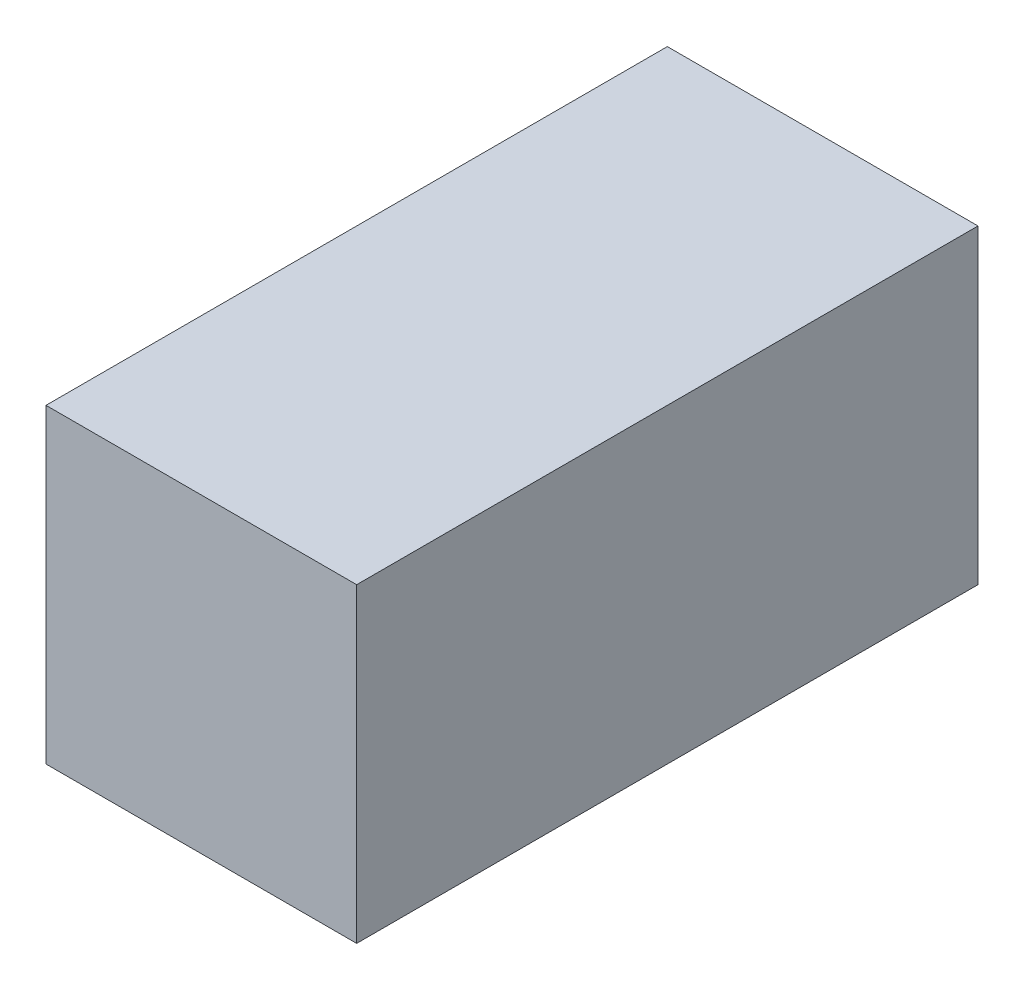
ISO-10303-21;
HEADER;
FILE_DESCRIPTION(('STEP AP214'),'2;1');
FILE_NAME('part.step','',(''),(''),'','','');
FILE_SCHEMA(('AUTOMOTIVE_DESIGN { 1 0 10303 214 1 1 1 1 }'));
ENDSEC;
DATA;
#1=APPLICATION_CONTEXT('core data for automotive mechanical design processes');
#2=APPLICATION_PROTOCOL_DEFINITION('international standard','automotive_design',2000,#1);
#3=PRODUCT_CONTEXT('',#1,'mechanical');
#4=PRODUCT('Part','Part','',(#3));
#5=PRODUCT_RELATED_PRODUCT_CATEGORY('part','',(#4));
#6=PRODUCT_DEFINITION_FORMATION('','',#4);
#7=PRODUCT_DEFINITION_CONTEXT('part definition',#1,'design');
#8=PRODUCT_DEFINITION('design','',#6,#7);
#9=PRODUCT_DEFINITION_SHAPE('','',#8);
#10=(LENGTH_UNIT() NAMED_UNIT(*) SI_UNIT(.MILLI.,.METRE.));
#11=(NAMED_UNIT(*) PLANE_ANGLE_UNIT() SI_UNIT($,.RADIAN.));
#12=(NAMED_UNIT(*) SI_UNIT($,.STERADIAN.) SOLID_ANGLE_UNIT());
#13=UNCERTAINTY_MEASURE_WITH_UNIT(LENGTH_MEASURE(1.E-05),#10,'distance_accuracy_value','');
#14=(GEOMETRIC_REPRESENTATION_CONTEXT(3) GLOBAL_UNCERTAINTY_ASSIGNED_CONTEXT((#13)) GLOBAL_UNIT_ASSIGNED_CONTEXT((#10,
#11,#12)) REPRESENTATION_CONTEXT('',''));
#15=CARTESIAN_POINT('',(0.,0.,0.));
#16=DIRECTION('',(0.,0.,1.));
#17=DIRECTION('',(1.,0.,0.));
#18=AXIS2_PLACEMENT_3D('',#15,#16,#17);
#19=CARTESIAN_POINT('',(0.,50.,100.));
#20=DIRECTION('',(1.,0.,0.));
#21=DIRECTION('',(0.,1.,0.));
#22=AXIS2_PLACEMENT_3D('',#19,#20,#21);
#23=PLANE('',#22);
#24=DIRECTION('',(0.,-1.,0.));
#25=VECTOR('',#24,1.);
#26=CARTESIAN_POINT('',(0.,50.,0.));
#27=LINE('',#26,#25);
#28=CARTESIAN_POINT('',(0.,50.,0.));
#29=VERTEX_POINT('',#28);
#30=CARTESIAN_POINT('',(0.,0.,0.));
#31=VERTEX_POINT('',#30);
#32=EDGE_CURVE('E100',#29,#31,#27,.T.);
#33=ORIENTED_EDGE('',*,*,#32,.T.);
#34=DIRECTION('',(0.,0.,-1.));
#35=VECTOR('',#34,1.);
#36=CARTESIAN_POINT('',(0.,0.,100.));
#37=LINE('',#36,#35);
#38=CARTESIAN_POINT('',(0.,0.,100.));
#39=VERTEX_POINT('',#38);
#40=EDGE_CURVE('E11',#39,#31,#37,.T.);
#41=ORIENTED_EDGE('',*,*,#40,.F.);
#42=DIRECTION('',(0.,-1.,0.));
#43=VECTOR('',#42,1.);
#44=CARTESIAN_POINT('',(0.,50.,100.));
#45=LINE('',#44,#43);
#46=CARTESIAN_POINT('',(0.,50.,100.));
#47=VERTEX_POINT('',#46);
#48=EDGE_CURVE('E88',#47,#39,#45,.T.);
#49=ORIENTED_EDGE('',*,*,#48,.F.);
#50=DIRECTION('',(0.,0.,-1.));
#51=VECTOR('',#50,1.);
#52=CARTESIAN_POINT('',(0.,50.,100.));
#53=LINE('',#52,#51);
#54=EDGE_CURVE('E96',#47,#29,#53,.T.);
#55=ORIENTED_EDGE('',*,*,#54,.T.);
#56=EDGE_LOOP('',(#33,#41,#49,#55));
#57=FACE_BOUND('',#56,.T.);
#58=ADVANCED_FACE('F37',(#57),#23,.F.);
#59=CARTESIAN_POINT('',(0.,0.,100.));
#60=DIRECTION('',(0.,1.,0.));
#61=DIRECTION('',(0.,0.,1.));
#62=AXIS2_PLACEMENT_3D('',#59,#60,#61);
#63=PLANE('',#62);
#64=DIRECTION('',(1.,0.,0.));
#65=VECTOR('',#64,1.);
#66=CARTESIAN_POINT('',(0.,0.,0.));
#67=LINE('',#66,#65);
#68=CARTESIAN_POINT('',(50.,0.,0.));
#69=VERTEX_POINT('',#68);
#70=EDGE_CURVE('E92',#31,#69,#67,.T.);
#71=ORIENTED_EDGE('',*,*,#70,.T.);
#72=DIRECTION('',(0.,0.,-1.));
#73=VECTOR('',#72,1.);
#74=CARTESIAN_POINT('',(50.,0.,100.));
#75=LINE('',#74,#73);
#76=CARTESIAN_POINT('',(50.,0.,100.));
#77=VERTEX_POINT('',#76);
#78=EDGE_CURVE('E45',#77,#69,#75,.T.);
#79=ORIENTED_EDGE('',*,*,#78,.F.);
#80=DIRECTION('',(1.,0.,0.));
#81=VECTOR('',#80,1.);
#82=CARTESIAN_POINT('',(0.,0.,100.));
#83=LINE('',#82,#81);
#84=EDGE_CURVE('E83',#39,#77,#83,.T.);
#85=ORIENTED_EDGE('',*,*,#84,.F.);
#86=ORIENTED_EDGE('',*,*,#40,.T.);
#87=EDGE_LOOP('',(#71,#79,#85,#86));
#88=FACE_BOUND('',#87,.T.);
#89=ADVANCED_FACE('F91',(#88),#63,.F.);
#90=CARTESIAN_POINT('',(50.,0.,100.));
#91=DIRECTION('',(-1.,0.,0.));
#92=DIRECTION('',(0.,-1.,0.));
#93=AXIS2_PLACEMENT_3D('',#90,#91,#92);
#94=PLANE('',#93);
#95=DIRECTION('',(0.,1.,0.));
#96=VECTOR('',#95,1.);
#97=CARTESIAN_POINT('',(50.,0.,0.));
#98=LINE('',#97,#96);
#99=CARTESIAN_POINT('',(50.,50.,0.));
#100=VERTEX_POINT('',#99);
#101=EDGE_CURVE('E70',#69,#100,#98,.T.);
#102=ORIENTED_EDGE('',*,*,#101,.T.);
#103=DIRECTION('',(0.,0.,-1.));
#104=VECTOR('',#103,1.);
#105=CARTESIAN_POINT('',(50.,50.,100.));
#106=LINE('',#105,#104);
#107=CARTESIAN_POINT('',(50.,50.,100.));
#108=VERTEX_POINT('',#107);
#109=EDGE_CURVE('E93',#108,#100,#106,.T.);
#110=ORIENTED_EDGE('',*,*,#109,.F.);
#111=DIRECTION('',(0.,1.,0.));
#112=VECTOR('',#111,1.);
#113=CARTESIAN_POINT('',(50.,0.,100.));
#114=LINE('',#113,#112);
#115=EDGE_CURVE('E86',#77,#108,#114,.T.);
#116=ORIENTED_EDGE('',*,*,#115,.F.);
#117=ORIENTED_EDGE('',*,*,#78,.T.);
#118=EDGE_LOOP('',(#102,#110,#116,#117));
#119=FACE_BOUND('',#118,.T.);
#120=ADVANCED_FACE('F94',(#119),#94,.F.);
#121=CARTESIAN_POINT('',(50.,50.,100.));
#122=DIRECTION('',(0.,-1.,0.));
#123=DIRECTION('',(1.,0.,0.));
#124=AXIS2_PLACEMENT_3D('',#121,#122,#123);
#125=PLANE('',#124);
#126=DIRECTION('',(-1.,0.,0.));
#127=VECTOR('',#126,1.);
#128=CARTESIAN_POINT('',(50.,50.,0.));
#129=LINE('',#128,#127);
#130=EDGE_CURVE('E76',#100,#29,#129,.T.);
#131=ORIENTED_EDGE('',*,*,#130,.T.);
#132=ORIENTED_EDGE('',*,*,#54,.F.);
#133=DIRECTION('',(-1.,0.,0.));
#134=VECTOR('',#133,1.);
#135=CARTESIAN_POINT('',(50.,50.,100.));
#136=LINE('',#135,#134);
#137=EDGE_CURVE('E53',#108,#47,#136,.T.);
#138=ORIENTED_EDGE('',*,*,#137,.F.);
#139=ORIENTED_EDGE('',*,*,#109,.T.);
#140=EDGE_LOOP('',(#131,#132,#138,#139));
#141=FACE_BOUND('',#140,.T.);
#142=ADVANCED_FACE('F107',(#141),#125,.F.);
#143=CARTESIAN_POINT('',(0.,0.,100.));
#144=DIRECTION('',(0.,0.,1.));
#145=DIRECTION('',(1.,0.,0.));
#146=AXIS2_PLACEMENT_3D('',#143,#144,#145);
#147=PLANE('',#146);
#148=ORIENTED_EDGE('',*,*,#48,.T.);
#149=ORIENTED_EDGE('',*,*,#84,.T.);
#150=ORIENTED_EDGE('',*,*,#115,.T.);
#151=ORIENTED_EDGE('',*,*,#137,.T.);
#152=EDGE_LOOP('',(#148,#149,#150,#151));
#153=FACE_BOUND('',#152,.T.);
#154=ADVANCED_FACE('F84',(#153),#147,.T.);
#155=CARTESIAN_POINT('',(0.,0.,0.));
#156=DIRECTION('',(0.,0.,1.));
#157=DIRECTION('',(1.,0.,0.));
#158=AXIS2_PLACEMENT_3D('',#155,#156,#157);
#159=PLANE('',#158);
#160=ORIENTED_EDGE('',*,*,#32,.F.);
#161=ORIENTED_EDGE('',*,*,#130,.F.);
#162=ORIENTED_EDGE('',*,*,#101,.F.);
#163=ORIENTED_EDGE('',*,*,#70,.F.);
#164=EDGE_LOOP('',(#160,#161,#162,#163));
#165=FACE_BOUND('',#164,.T.);
#166=ADVANCED_FACE('F110',(#165),#159,.F.);
#167=CLOSED_SHELL('',(#58,#89,#120,#142,#154,#166));
#168=MANIFOLD_SOLID_BREP('B2',#167);
#169=ADVANCED_BREP_SHAPE_REPRESENTATION('',(#18,#168),#14);
#170=SHAPE_DEFINITION_REPRESENTATION(#9,#169);
ENDSEC;
END-ISO-10303-21;
